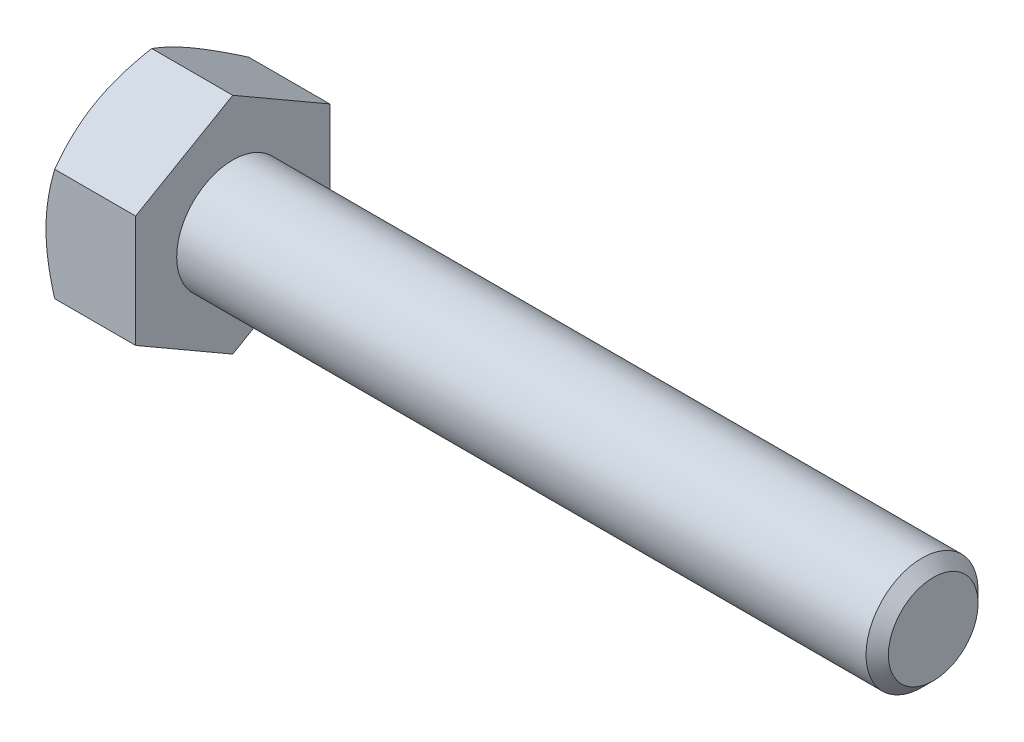
ISO-10303-21;
HEADER;
FILE_DESCRIPTION(('STEP AP214'),'2;1');
FILE_NAME('part.step','',(''),(''),'','','');
FILE_SCHEMA(('AUTOMOTIVE_DESIGN { 1 0 10303 214 1 1 1 1 }'));
ENDSEC;
DATA;
#1=APPLICATION_CONTEXT('core data for automotive mechanical design processes');
#2=APPLICATION_PROTOCOL_DEFINITION('international standard','automotive_design',2000,#1);
#3=PRODUCT_CONTEXT('',#1,'mechanical');
#4=PRODUCT('Part','Part','',(#3));
#5=PRODUCT_RELATED_PRODUCT_CATEGORY('part','',(#4));
#6=PRODUCT_DEFINITION_FORMATION('','',#4);
#7=PRODUCT_DEFINITION_CONTEXT('part definition',#1,'design');
#8=PRODUCT_DEFINITION('design','',#6,#7);
#9=PRODUCT_DEFINITION_SHAPE('','',#8);
#10=(LENGTH_UNIT() NAMED_UNIT(*) SI_UNIT(.MILLI.,.METRE.));
#11=(NAMED_UNIT(*) PLANE_ANGLE_UNIT() SI_UNIT($,.RADIAN.));
#12=(NAMED_UNIT(*) SI_UNIT($,.STERADIAN.) SOLID_ANGLE_UNIT());
#13=UNCERTAINTY_MEASURE_WITH_UNIT(LENGTH_MEASURE(1.E-05),#10,'distance_accuracy_value','');
#14=(GEOMETRIC_REPRESENTATION_CONTEXT(3) GLOBAL_UNCERTAINTY_ASSIGNED_CONTEXT((#13)) GLOBAL_UNIT_ASSIGNED_CONTEXT((#10,
#11,#12)) REPRESENTATION_CONTEXT('',''));
#15=CARTESIAN_POINT('',(0.,0.,0.));
#16=DIRECTION('',(0.,0.,1.));
#17=DIRECTION('',(1.,0.,0.));
#18=AXIS2_PLACEMENT_3D('',#15,#16,#17);
#19=CARTESIAN_POINT('',(19.2,-18.,10.3923048454133));
#20=DIRECTION('',(0.,0.866025403784439,-0.5));
#21=DIRECTION('',(0.,0.5,0.866025403784439));
#22=AXIS2_PLACEMENT_3D('',#19,#20,#21);
#23=PLANE('',#22);
#24=CARTESIAN_POINT('',(1.8564731276988,-24.0001154700538,-0.000200000000003051));
#25=CARTESIAN_POINT('',(1.70420497682992,-23.7363605616872,0.456636902036741));
#26=CARTESIAN_POINT('',(1.55884654250785,-23.4715768677398,0.915255712969345));
#27=CARTESIAN_POINT('',(1.28386975831447,-22.9398862308411,1.83617090998652));
#28=CARTESIAN_POINT('',(1.15425658531419,-22.6729786201371,2.29846845265265));
#29=CARTESIAN_POINT('',(0.912512595846756,-22.1365243076466,3.22763457782561));
#30=CARTESIAN_POINT('',(0.800423144133508,-21.8669729114129,3.69451129135353));
#31=CARTESIAN_POINT('',(0.596133528378377,-21.3259971369607,4.63150881836863));
#32=CARTESIAN_POINT('',(0.503932225275748,-21.0545728669274,5.10162944447372));
#33=CARTESIAN_POINT('',(0.343340490949208,-20.5168061337673,6.03306874892725));
#34=CARTESIAN_POINT('',(0.274418527658166,-20.2505035939992,6.49431827799029));
#35=CARTESIAN_POINT('',(0.158852016136899,-19.7166782897964,7.41893082723538));
#36=CARTESIAN_POINT('',(0.112207896719898,-19.449155501974,7.88229388792627));
#37=CARTESIAN_POINT('',(0.0423748141827282,-18.9136605340693,8.8097983795347));
#38=CARTESIAN_POINT('',(0.0191579795280419,-18.6456892688105,9.2739382259314));
#39=CARTESIAN_POINT('',(-0.00332126042467664,-18.1094994426216,10.2026462473922));
#40=CARTESIAN_POINT('',(-0.00258440592872094,-17.8412808895892,10.667214408777));
#41=CARTESIAN_POINT('',(0.0211707638629725,-17.3398411459993,11.5357335216089));
#42=CARTESIAN_POINT('',(0.041292345668217,-17.1065842440052,11.9397463270788));
#43=CARTESIAN_POINT('',(0.0992698070061981,-16.6406273093356,12.7468074120657));
#44=CARTESIAN_POINT('',(0.137125432541254,-16.4079272687324,13.1498557053137));
#45=CARTESIAN_POINT('',(0.229914897964642,-15.9431700326962,13.9548388513136));
#46=CARTESIAN_POINT('',(0.28486418136647,-15.7111136107975,14.3567723642649));
#47=CARTESIAN_POINT('',(0.410868445121499,-15.2481118982151,15.158714854449));
#48=CARTESIAN_POINT('',(0.481923357233602,-15.0171666028277,15.5587238398289));
#49=CARTESIAN_POINT('',(0.72107005873722,-14.3160658221991,16.7730660131039));
#50=CARTESIAN_POINT('',(0.913020547282522,-13.8479022980801,17.5839490231285));
#51=CARTESIAN_POINT('',(1.23980731969377,-13.1508272022203,18.7913185058486));
#52=CARTESIAN_POINT('',(1.35509548926815,-12.9195302834635,19.1919365207695));
#53=CARTESIAN_POINT('',(1.59734334708933,-12.458536301089,19.9904015202257));
#54=CARTESIAN_POINT('',(1.72429974567885,-12.2288388060681,20.3882492519732));
#55=CARTESIAN_POINT('',(1.8564731276988,-11.9998845299462,20.7848096908265));
#56=B_SPLINE_CURVE_WITH_KNOTS('',3,(#24,#25,#26,#27,#28,#29,#30,#31,#32,#33,#34,#35,#36,#37,#38,
#39,#40,#41,#42,#43,#44,#45,#46,#47,#48,#49,#50,#51,#52,#53,#54,#55),.UNSPECIFIED.,.F.,.F.,(4,2,
2,2,2,2,2,2,2,2,2,2,2,2,2,4),(0.,1.64718297300076,3.29490606443561,4.94646171874215,
6.59792275780601,8.2086223270406,9.81935289844249,11.4281649098404,13.0369272065082,
14.4374315945823,15.8379159244004,17.2396692350121,18.6414166063712,21.5066563429886,
22.9367804503372,24.3665025883493),.UNSPECIFIED.);
#57=CARTESIAN_POINT('',(1.85640646055101,-24.,0.));
#58=VERTEX_POINT('',#57);
#59=CARTESIAN_POINT('',(0.,-18.,10.3923048454133));
#60=VERTEX_POINT('',#59);
#61=EDGE_CURVE('E243',#58,#60,#56,.T.);
#62=ORIENTED_EDGE('',*,*,#61,.F.);
#63=DIRECTION('',(-1.,0.,0.));
#64=VECTOR('',#63,1.);
#65=CARTESIAN_POINT('',(19.2,-24.,0.));
#66=LINE('',#65,#64);
#67=CARTESIAN_POINT('',(19.2,-24.,0.));
#68=VERTEX_POINT('',#67);
#69=EDGE_CURVE('E140',#68,#58,#66,.T.);
#70=ORIENTED_EDGE('',*,*,#69,.F.);
#71=DIRECTION('',(0.,-0.5,-0.866025403784439));
#72=VECTOR('',#71,1.);
#73=CARTESIAN_POINT('',(19.2,-18.,10.3923048454133));
#74=LINE('',#73,#72);
#75=CARTESIAN_POINT('',(19.2,-12.,20.7846096908265));
#76=VERTEX_POINT('',#75);
#77=EDGE_CURVE('E409',#76,#68,#74,.T.);
#78=ORIENTED_EDGE('',*,*,#77,.F.);
#79=DIRECTION('',(-1.,0.,0.));
#80=VECTOR('',#79,1.);
#81=CARTESIAN_POINT('',(19.2,-12.,20.7846096908265));
#82=LINE('',#81,#80);
#83=CARTESIAN_POINT('',(1.85640646055101,-12.,20.7846096908265));
#84=VERTEX_POINT('',#83);
#85=EDGE_CURVE('E397',#76,#84,#82,.T.);
#86=ORIENTED_EDGE('',*,*,#85,.T.);
#87=EDGE_CURVE('E195',#60,#84,#56,.T.);
#88=ORIENTED_EDGE('',*,*,#87,.F.);
#89=EDGE_LOOP('',(#62,#70,#78,#86,#88));
#90=FACE_BOUND('',#89,.T.);
#91=ADVANCED_FACE('F42',(#90),#23,.F.);
#92=CARTESIAN_POINT('',(19.2,-18.,-10.3923048454133));
#93=DIRECTION('',(0.,0.866025403784438,0.5));
#94=DIRECTION('',(0.,-0.5,0.866025403784439));
#95=AXIS2_PLACEMENT_3D('',#92,#93,#94);
#96=PLANE('',#95);
#97=CARTESIAN_POINT('',(1.8564731276988,-11.9998845299462,-20.7848096908265));
#98=CARTESIAN_POINT('',(1.70420497682991,-12.2636394383128,-20.3279727887898));
#99=CARTESIAN_POINT('',(1.55884654250784,-12.5284231322602,-19.8693539778572));
#100=CARTESIAN_POINT('',(1.28386975831447,-13.0601137691589,-18.94843878084));
#101=CARTESIAN_POINT('',(1.15425658531418,-13.3270213798629,-18.4861412381739));
#102=CARTESIAN_POINT('',(0.912512595846757,-13.8634756923534,-17.5569751130009));
#103=CARTESIAN_POINT('',(0.80042314413351,-14.1330270885871,-17.090098399473));
#104=CARTESIAN_POINT('',(0.596133528378377,-14.6740028630393,-16.1531008724579));
#105=CARTESIAN_POINT('',(0.503932225275748,-14.9454271330726,-15.6829802463528));
#106=CARTESIAN_POINT('',(0.343340490949207,-15.4831938662327,-14.7515409418993));
#107=CARTESIAN_POINT('',(0.274418527658167,-15.7494964060008,-14.2902914128362));
#108=CARTESIAN_POINT('',(0.158852016136901,-16.2833217102036,-13.3656788635911));
#109=CARTESIAN_POINT('',(0.112207896719899,-16.550844498026,-12.9023158029003));
#110=CARTESIAN_POINT('',(0.0423748141827289,-17.0863394659307,-11.9748113112918));
#111=CARTESIAN_POINT('',(0.0191579795280428,-17.3543107311895,-11.5106714648951));
#112=CARTESIAN_POINT('',(-0.00332126042467492,-17.8905005573784,-10.5819634434344));
#113=CARTESIAN_POINT('',(-0.00258440592871848,-18.1587191104109,-10.1173952820495));
#114=CARTESIAN_POINT('',(0.0211707638629761,-18.6601588540007,-9.24887616921767));
#115=CARTESIAN_POINT('',(0.0412923456682211,-18.8934157559948,-8.84486336374769));
#116=CARTESIAN_POINT('',(0.0992698070062012,-19.3593726906644,-8.03780227876087));
#117=CARTESIAN_POINT('',(0.137125432541256,-19.5920727312676,-7.6347539855128));
#118=CARTESIAN_POINT('',(0.229914897964644,-20.0568299673038,-6.82977083951292));
#119=CARTESIAN_POINT('',(0.284864181366474,-20.2888863892025,-6.42783732656168));
#120=CARTESIAN_POINT('',(0.410868445121505,-20.7518881017849,-5.62589483637756));
#121=CARTESIAN_POINT('',(0.481923357233607,-20.9828333971723,-5.2258858509976));
#122=CARTESIAN_POINT('',(0.721070058737223,-21.6839341778009,-4.01154367772264));
#123=CARTESIAN_POINT('',(0.913020547282525,-22.1520977019199,-3.200660667698));
#124=CARTESIAN_POINT('',(1.23980731969378,-22.8491727977797,-1.99329118497798));
#125=CARTESIAN_POINT('',(1.35509548926815,-23.0804697165365,-1.59267317005705));
#126=CARTESIAN_POINT('',(1.59734334708933,-23.541463698911,-0.794208170600867));
#127=CARTESIAN_POINT('',(1.72429974567886,-23.7711611939319,-0.396360438853321));
#128=CARTESIAN_POINT('',(1.85647312769881,-24.0001154700538,0.000199999999993356));
#129=B_SPLINE_CURVE_WITH_KNOTS('',3,(#97,#98,#99,#100,#101,#102,#103,#104,#105,#106,#107,#108,
#109,#110,#111,#112,#113,#114,#115,#116,#117,#118,#119,#120,#121,#122,#123,#124,#125,#126,#127,
#128),.UNSPECIFIED.,.F.,.F.,(4,2,2,2,2,2,2,2,2,2,2,2,2,2,2,4),(0.,1.64718297300076,
3.29490606443561,4.94646171874215,6.59792275780601,8.20862232704061,9.81935289844249,
11.4281649098404,13.0369272065082,14.4374315945823,15.8379159244004,17.2396692350121,
18.6414166063712,21.5066563429886,22.9367804503372,24.3665025883493),.UNSPECIFIED.);
#130=CARTESIAN_POINT('',(1.85640646055101,-12.,-20.7846096908265));
#131=VERTEX_POINT('',#130);
#132=CARTESIAN_POINT('',(0.,-18.,-10.3923048454133));
#133=VERTEX_POINT('',#132);
#134=EDGE_CURVE('E135',#131,#133,#129,.T.);
#135=ORIENTED_EDGE('',*,*,#134,.F.);
#136=DIRECTION('',(-1.,0.,0.));
#137=VECTOR('',#136,1.);
#138=CARTESIAN_POINT('',(19.2,-12.,-20.7846096908265));
#139=LINE('',#138,#137);
#140=CARTESIAN_POINT('',(19.2,-12.,-20.7846096908265));
#141=VERTEX_POINT('',#140);
#142=EDGE_CURVE('E149',#141,#131,#139,.T.);
#143=ORIENTED_EDGE('',*,*,#142,.F.);
#144=DIRECTION('',(0.,0.5,-0.866025403784438));
#145=VECTOR('',#144,1.);
#146=CARTESIAN_POINT('',(19.2,-18.,-10.3923048454133));
#147=LINE('',#146,#145);
#148=EDGE_CURVE('E249',#68,#141,#147,.T.);
#149=ORIENTED_EDGE('',*,*,#148,.F.);
#150=ORIENTED_EDGE('',*,*,#69,.T.);
#151=EDGE_CURVE('E159',#133,#58,#129,.T.);
#152=ORIENTED_EDGE('',*,*,#151,.F.);
#153=EDGE_LOOP('',(#135,#143,#149,#150,#152));
#154=FACE_BOUND('',#153,.T.);
#155=ADVANCED_FACE('F232',(#154),#96,.F.);
#156=CARTESIAN_POINT('',(19.2,0.,-20.7846096908265));
#157=DIRECTION('',(0.,0.,1.));
#158=DIRECTION('',(0.,-1.,0.));
#159=AXIS2_PLACEMENT_3D('',#156,#157,#158);
#160=PLANE('',#159);
#161=CARTESIAN_POINT('',(15.4365753826942,42.7351963396777,-20.7846096908265));
#162=CARTESIAN_POINT('',(15.1782001230141,42.2375504579259,-20.7846096908265));
#163=CARTESIAN_POINT('',(14.9205008424216,41.7395537279378,-20.7846096908265));
#164=CARTESIAN_POINT('',(14.4065935235221,40.7427897192709,-20.7846096908265));
#165=CARTESIAN_POINT('',(14.1503854894428,40.2440224384126,-20.7846096908265));
#166=CARTESIAN_POINT('',(13.3841874976782,38.7464229614954,-20.7846096908265));
#167=CARTESIAN_POINT('',(12.8766458079479,37.7463357499289,-20.7846096908265));
#168=CARTESIAN_POINT('',(11.8687046110495,35.740585285373,-20.7846096908265));
#169=CARTESIAN_POINT('',(11.3683176523895,34.7349157197309,-20.7846096908265));
#170=CARTESIAN_POINT('',(10.3773529444861,32.7187656852211,-20.7846096908265));
#171=CARTESIAN_POINT('',(9.88677504418478,31.7082852907364,-20.7846096908265));
#172=CARTESIAN_POINT('',(8.89098212398312,29.6253151675214,-20.7846096908265));
#173=CARTESIAN_POINT('',(8.38646255239789,28.5524923063502,-20.7846096908265));
#174=CARTESIAN_POINT('',(7.39477343103312,26.398760720087,-20.7846096908265));
#175=CARTESIAN_POINT('',(6.9076046018839,25.3178516614009,-20.7846096908265));
#176=CARTESIAN_POINT('',(6.19395911010642,23.6893359387004,-20.7846096908265));
#177=CARTESIAN_POINT('',(5.95898796329796,23.1454489410646,-20.7846096908265));
#178=CARTESIAN_POINT('',(5.49555007418073,22.0549139153183,-20.7846096908265));
#179=CARTESIAN_POINT('',(5.26708324689029,21.5082659233915,-20.7846096908265));
#180=CARTESIAN_POINT('',(4.81763359191787,20.4119412090459,-20.7846096908265));
#181=CARTESIAN_POINT('',(4.59665024200561,19.8622647010961,-20.7846096908265));
#182=CARTESIAN_POINT('',(4.16330092883257,18.7595322812737,-20.7846096908265));
#183=CARTESIAN_POINT('',(3.9509347919298,18.2064764377555,-20.7846096908265));
#184=CARTESIAN_POINT('',(3.50964661408538,17.0257175003698,-20.7846096908265));
#185=CARTESIAN_POINT('',(3.28207699733136,16.3975069770108,-20.7846096908265));
#186=CARTESIAN_POINT('',(2.84185286992129,15.1358634730652,-20.7846096908265));
#187=CARTESIAN_POINT('',(2.62919832486909,14.502430504526,-20.7846096908265));
#188=CARTESIAN_POINT('',(2.22142797041994,13.2297874539747,-20.7846096908265));
#189=CARTESIAN_POINT('',(2.02631541783627,12.5905763233441,-20.7846096908265));
#190=CARTESIAN_POINT('',(1.65674077494716,11.3061766050275,-20.7846096908265));
#191=CARTESIAN_POINT('',(1.48227865352408,10.6609880263503,-20.7846096908265));
#192=CARTESIAN_POINT('',(1.16069442824226,9.37757944037591,-20.7846096908265));
#193=CARTESIAN_POINT('',(1.01309291973356,8.73948035870573,-20.7846096908265));
#194=CARTESIAN_POINT('',(0.744428159888322,7.45773163993493,-20.7846096908265));
#195=CARTESIAN_POINT('',(0.623362581757385,6.81408249463785,-20.7846096908265));
#196=CARTESIAN_POINT('',(0.411160078732894,5.52212335543822,-20.7846096908265));
#197=CARTESIAN_POINT('',(0.320009542439026,4.87381561880367,-20.7846096908265));
#198=CARTESIAN_POINT('',(0.170501882779792,3.57339987577271,-20.7846096908265));
#199=CARTESIAN_POINT('',(0.112144274499404,2.92129192571483,-20.7846096908265));
#200=CARTESIAN_POINT('',(0.0296859334714068,1.60463292415903,-20.7846096908265));
#201=CARTESIAN_POINT('',(0.00613586787265403,0.940046910142542,-20.7846096908265));
#202=CARTESIAN_POINT('',(-0.00403039108903835,-0.389409138129747,-20.7846096908265));
#203=CARTESIAN_POINT('',(0.00935336688645884,-1.05427917201019,-20.7846096908265));
#204=CARTESIAN_POINT('',(0.0725267417839819,-2.38241239876369,-20.7846096908265));
#205=CARTESIAN_POINT('',(0.122324318983771,-3.04567520847449,-20.7846096908265));
#206=CARTESIAN_POINT('',(0.256441221489205,-4.36867761851294,-20.7846096908265));
#207=CARTESIAN_POINT('',(0.340761456006645,-5.0284171255849,-20.7846096908265));
#208=CARTESIAN_POINT('',(0.543132854242192,-6.356870471909,-20.7846096908265));
#209=CARTESIAN_POINT('',(0.661856749114912,-7.02548085274417,-20.7846096908265));
#210=CARTESIAN_POINT('',(0.928598305854016,-8.3567871779243,-20.7846096908265));
#211=CARTESIAN_POINT('',(1.07661642314574,-9.01948303015109,-20.7846096908265));
#212=CARTESIAN_POINT('',(1.39817496043688,-10.3388158753969,-20.7846096908265));
#213=CARTESIAN_POINT('',(1.57172301041282,-10.9954509945151,-20.7846096908265));
#214=CARTESIAN_POINT('',(1.94066974695683,-12.3025159921132,-20.7846096908265));
#215=CARTESIAN_POINT('',(2.13606850262356,-12.9529458509631,-20.7846096908265));
#216=CARTESIAN_POINT('',(2.54787647733615,-14.2556215747884,-20.7846096908265));
#217=CARTESIAN_POINT('',(2.76450834199087,-14.9077966991281,-20.7846096908265));
#218=CARTESIAN_POINT('',(3.21385089652054,-16.2066062021254,-20.7846096908265));
#219=CARTESIAN_POINT('',(3.44656260738667,-16.8532402260149,-20.7846096908265));
#220=CARTESIAN_POINT('',(3.925608321145,-18.1416069191262,-20.7846096908265));
#221=CARTESIAN_POINT('',(4.17194567395359,-18.7833383384918,-20.7846096908265));
#222=CARTESIAN_POINT('',(4.67608824983811,-20.0622534059696,-20.7846096908265));
#223=CARTESIAN_POINT('',(4.93389324742564,-20.6994371432173,-20.7846096908265));
#224=CARTESIAN_POINT('',(5.45957252564696,-21.9705929002849,-20.7846096908265));
#225=CARTESIAN_POINT('',(5.72745939094396,-22.604559704099,-20.7846096908265));
#226=CARTESIAN_POINT('',(6.27153990979845,-23.8689150095967,-20.7846096908265));
#227=CARTESIAN_POINT('',(6.54773359625541,-24.4993034970964,-20.7846096908265));
#228=CARTESIAN_POINT('',(7.1071859341126,-25.7568294075045,-20.7846096908265));
#229=CARTESIAN_POINT('',(7.3904436096661,-26.3839672651679,-20.7846096908265));
#230=CARTESIAN_POINT('',(7.96306773382719,-27.6354418873609,-20.7846096908265));
#231=CARTESIAN_POINT('',(8.25243416982651,-28.2597786576686,-20.7846096908265));
#232=CARTESIAN_POINT('',(9.09261210441168,-30.0526700155559,-20.7846096908265));
#233=CARTESIAN_POINT('',(9.65006402044101,-31.2181138600505,-20.7846096908265));
#234=CARTESIAN_POINT('',(10.7792267251682,-33.5421025420665,-20.7846096908265));
#235=CARTESIAN_POINT('',(11.3509380716336,-34.7006471075152,-20.7846096908265));
#236=CARTESIAN_POINT('',(12.5033567528949,-37.0077945469623,-20.7846096908265));
#237=CARTESIAN_POINT('',(13.0840220705692,-38.1564184327317,-20.7846096908265));
#238=CARTESIAN_POINT('',(13.9616188799111,-39.8759132018085,-20.7846096908265));
#239=CARTESIAN_POINT('',(14.2552377532654,-40.4484792332988,-20.7846096908265));
#240=CARTESIAN_POINT('',(14.8444666900635,-41.5925826559036,-20.7846096908265));
#241=CARTESIAN_POINT('',(15.1400767444053,-42.164120051705,-20.7846096908265));
#242=CARTESIAN_POINT('',(15.4365753826942,-42.7351963396777,-20.7846096908265));
#243=B_SPLINE_CURVE_WITH_KNOTS('',3,(#161,#162,#163,#164,#165,#166,#167,#168,#169,#170,#171,
#172,#173,#174,#175,#176,#177,#178,#179,#180,#181,#182,#183,#184,#185,#186,#187,#188,#189,#190,
#191,#192,#193,#194,#195,#196,#197,#198,#199,#200,#201,#202,#203,#204,#205,#206,#207,#208,#209,
#210,#211,#212,#213,#214,#215,#216,#217,#218,#219,#220,#221,#222,#223,#224,#225,#226,#227,#228,
#229,#230,#231,#232,#233,#234,#235,#236,#237,#238,#239,#240,#241,#242),.UNSPECIFIED.,.F.,.F.,(4,
2,2,2,2,2,2,2,2,2,2,2,2,2,2,2,2,2,2,2,2,2,2,2,2,2,2,2,2,2,2,2,2,2,2,2,2,2,2,2,4),(0.,
1.68216511624376,3.3643349990115,6.72881886572706,10.0986173985111,13.468363996922,
17.0248524624178,20.5814884680961,22.3588742955726,24.1362368900912,25.9134751956865,
27.6906776710652,29.69499374197,31.6993051905018,33.7039879905968,35.7086677698428,
37.6730184948026,39.637196907343,41.6004803719791,43.5637348044197,45.5577279859555,
47.5517185403391,49.5461451232969,51.5406242361865,53.5770909409603,55.6135893083398,
57.650697552863,59.6878122395322,61.7492048973111,63.810728563878,65.8727613364008,
67.9347535810604,69.9994111245146,72.0640768461977,74.1284589098883,76.192836713184,
80.068401521298,83.9441181633394,87.8052301786373,89.7356145319587,91.6659900672801),.UNSPECIFIED.);
#244=CARTESIAN_POINT('',(1.85640646055101,12.,-20.7846096908265));
#245=VERTEX_POINT('',#244);
#246=CARTESIAN_POINT('',(0.,0.,-20.7846096908265));
#247=VERTEX_POINT('',#246);
#248=EDGE_CURVE('E114',#245,#247,#243,.T.);
#249=ORIENTED_EDGE('',*,*,#248,.F.);
#250=DIRECTION('',(-1.,0.,0.));
#251=VECTOR('',#250,1.);
#252=CARTESIAN_POINT('',(19.2,12.,-20.7846096908265));
#253=LINE('',#252,#251);
#254=CARTESIAN_POINT('',(19.2,12.,-20.7846096908265));
#255=VERTEX_POINT('',#254);
#256=EDGE_CURVE('E252',#255,#245,#253,.T.);
#257=ORIENTED_EDGE('',*,*,#256,.F.);
#258=DIRECTION('',(0.,1.,0.));
#259=VECTOR('',#258,1.);
#260=CARTESIAN_POINT('',(19.2,0.,-20.7846096908265));
#261=LINE('',#260,#259);
#262=EDGE_CURVE('E404',#141,#255,#261,.T.);
#263=ORIENTED_EDGE('',*,*,#262,.F.);
#264=ORIENTED_EDGE('',*,*,#142,.T.);
#265=EDGE_CURVE('E127',#247,#131,#243,.T.);
#266=ORIENTED_EDGE('',*,*,#265,.F.);
#267=EDGE_LOOP('',(#249,#257,#263,#264,#266));
#268=FACE_BOUND('',#267,.T.);
#269=ADVANCED_FACE('F146',(#268),#160,.F.);
#270=CARTESIAN_POINT('',(19.2,18.,-10.3923048454133));
#271=DIRECTION('',(0.,-0.866025403784439,0.5));
#272=DIRECTION('',(0.,-0.5,-0.866025403784439));
#273=AXIS2_PLACEMENT_3D('',#270,#271,#272);
#274=PLANE('',#273);
#275=CARTESIAN_POINT('',(1.8564731276988,24.0001154700538,0.000200000000004368));
#276=CARTESIAN_POINT('',(1.70420497682991,23.7363605616872,-0.45663690203674));
#277=CARTESIAN_POINT('',(1.55884654250784,23.4715768677398,-0.915255712969344));
#278=CARTESIAN_POINT('',(1.28386975831447,22.9398862308411,-1.83617090998652));
#279=CARTESIAN_POINT('',(1.15425658531418,22.6729786201371,-2.29846845265265));
#280=CARTESIAN_POINT('',(0.912512595846754,22.1365243076466,-3.22763457782561));
#281=CARTESIAN_POINT('',(0.800423144133507,21.8669729114129,-3.69451129135353));
#282=CARTESIAN_POINT('',(0.596133528378375,21.3259971369607,-4.63150881836863));
#283=CARTESIAN_POINT('',(0.503932225275746,21.0545728669274,-5.10162944447372));
#284=CARTESIAN_POINT('',(0.343340490949205,20.5168061337673,-6.03306874892725));
#285=CARTESIAN_POINT('',(0.274418527658163,20.2505035939992,-6.4943182779903));
#286=CARTESIAN_POINT('',(0.158852016136896,19.7166782897964,-7.41893082723539));
#287=CARTESIAN_POINT('',(0.112207896719895,19.449155501974,-7.88229388792627));
#288=CARTESIAN_POINT('',(0.0423748141827256,18.9136605340693,-8.8097983795347));
#289=CARTESIAN_POINT('',(0.0191579795280395,18.6456892688105,-9.2739382259314));
#290=CARTESIAN_POINT('',(-0.00332126042467856,18.1094994426216,-10.2026462473922));
#291=CARTESIAN_POINT('',(-0.00258440592872253,17.8412808895891,-10.667214408777));
#292=CARTESIAN_POINT('',(0.0211707638629718,17.3398411459993,-11.5357335216089));
#293=CARTESIAN_POINT('',(0.0412923456682169,17.1065842440052,-11.9397463270788));
#294=CARTESIAN_POINT('',(0.0992698070061978,16.6406273093356,-12.7468074120657));
#295=CARTESIAN_POINT('',(0.137125432541253,16.4079272687324,-13.1498557053137));
#296=CARTESIAN_POINT('',(0.229914897964641,15.9431700326962,-13.9548388513136));
#297=CARTESIAN_POINT('',(0.28486418136647,15.7111136107975,-14.3567723642648));
#298=CARTESIAN_POINT('',(0.4108684451215,15.2481118982151,-15.158714854449));
#299=CARTESIAN_POINT('',(0.481923357233603,15.0171666028277,-15.5587238398289));
#300=CARTESIAN_POINT('',(0.72107005873722,14.3160658221991,-16.7730660131039));
#301=CARTESIAN_POINT('',(0.913020547282522,13.8479022980801,-17.5839490231285));
#302=CARTESIAN_POINT('',(1.23980731969377,13.1508272022203,-18.7913185058486));
#303=CARTESIAN_POINT('',(1.35509548926815,12.9195302834635,-19.1919365207695));
#304=CARTESIAN_POINT('',(1.59734334708933,12.458536301089,-19.9904015202257));
#305=CARTESIAN_POINT('',(1.72429974567885,12.2288388060681,-20.3882492519732));
#306=CARTESIAN_POINT('',(1.8564731276988,11.9998845299462,-20.7848096908265));
#307=B_SPLINE_CURVE_WITH_KNOTS('',3,(#275,#276,#277,#278,#279,#280,#281,#282,#283,#284,#285,
#286,#287,#288,#289,#290,#291,#292,#293,#294,#295,#296,#297,#298,#299,#300,#301,#302,#303,#304,
#305,#306),.UNSPECIFIED.,.F.,.F.,(4,2,2,2,2,2,2,2,2,2,2,2,2,2,2,4),(0.,1.64718297300076,
3.29490606443561,4.94646171874214,6.59792275780601,8.20862232704061,9.81935289844249,
11.4281649098404,13.0369272065082,14.4374315945823,15.8379159244004,17.2396692350121,
18.6414166063712,21.5066563429886,22.9367804503372,24.3665025883493),.UNSPECIFIED.);
#308=CARTESIAN_POINT('',(1.85640646055101,24.,0.));
#309=VERTEX_POINT('',#308);
#310=CARTESIAN_POINT('',(0.,18.,-10.3923048454133));
#311=VERTEX_POINT('',#310);
#312=EDGE_CURVE('E58',#309,#311,#307,.T.);
#313=ORIENTED_EDGE('',*,*,#312,.F.);
#314=DIRECTION('',(-1.,0.,0.));
#315=VECTOR('',#314,1.);
#316=CARTESIAN_POINT('',(19.2,24.,0.));
#317=LINE('',#316,#315);
#318=CARTESIAN_POINT('',(19.2,24.,0.));
#319=VERTEX_POINT('',#318);
#320=EDGE_CURVE('E389',#319,#309,#317,.T.);
#321=ORIENTED_EDGE('',*,*,#320,.F.);
#322=DIRECTION('',(0.,0.5,0.866025403784439));
#323=VECTOR('',#322,1.);
#324=CARTESIAN_POINT('',(19.2,18.,-10.3923048454133));
#325=LINE('',#324,#323);
#326=EDGE_CURVE('E403',#255,#319,#325,.T.);
#327=ORIENTED_EDGE('',*,*,#326,.F.);
#328=ORIENTED_EDGE('',*,*,#256,.T.);
#329=EDGE_CURVE('E121',#311,#245,#307,.T.);
#330=ORIENTED_EDGE('',*,*,#329,.F.);
#331=EDGE_LOOP('',(#313,#321,#327,#328,#330));
#332=FACE_BOUND('',#331,.T.);
#333=ADVANCED_FACE('F205',(#332),#274,.F.);
#334=CARTESIAN_POINT('',(19.2,18.,10.3923048454133));
#335=DIRECTION('',(0.,-0.866025403784439,-0.5));
#336=DIRECTION('',(0.,0.5,-0.866025403784439));
#337=AXIS2_PLACEMENT_3D('',#334,#335,#336);
#338=PLANE('',#337);
#339=CARTESIAN_POINT('',(1.8564731276988,11.9998845299462,20.7848096908265));
#340=CARTESIAN_POINT('',(1.70420497682991,12.2636394383128,20.3279727887898));
#341=CARTESIAN_POINT('',(1.55884654250784,12.5284231322602,19.8693539778572));
#342=CARTESIAN_POINT('',(1.28386975831447,13.0601137691589,18.94843878084));
#343=CARTESIAN_POINT('',(1.15425658531418,13.3270213798629,18.4861412381739));
#344=CARTESIAN_POINT('',(0.912512595846756,13.8634756923534,17.5569751130009));
#345=CARTESIAN_POINT('',(0.800423144133508,14.1330270885871,17.090098399473));
#346=CARTESIAN_POINT('',(0.596133528378377,14.6740028630393,16.1531008724579));
#347=CARTESIAN_POINT('',(0.503932225275748,14.9454271330726,15.6829802463528));
#348=CARTESIAN_POINT('',(0.343340490949207,15.4831938662327,14.7515409418993));
#349=CARTESIAN_POINT('',(0.274418527658165,15.7494964060008,14.2902914128362));
#350=CARTESIAN_POINT('',(0.158852016136897,16.2833217102036,13.3656788635911));
#351=CARTESIAN_POINT('',(0.112207896719896,16.550844498026,12.9023158029003));
#352=CARTESIAN_POINT('',(0.0423748141827269,17.0863394659307,11.9748113112918));
#353=CARTESIAN_POINT('',(0.0191579795280418,17.3543107311895,11.5106714648951));
#354=CARTESIAN_POINT('',(-0.00332126042467567,17.8905005573784,10.5819634434344));
#355=CARTESIAN_POINT('',(-0.00258440592871992,18.1587191104109,10.1173952820495));
#356=CARTESIAN_POINT('',(0.0211707638629734,18.6601588540007,9.24887616921766));
#357=CARTESIAN_POINT('',(0.0412923456682176,18.8934157559948,8.84486336374768));
#358=CARTESIAN_POINT('',(0.0992698070061979,19.3593726906644,8.03780227876086));
#359=CARTESIAN_POINT('',(0.137125432541254,19.5920727312676,7.6347539855128));
#360=CARTESIAN_POINT('',(0.229914897964642,20.0568299673038,6.82977083951292));
#361=CARTESIAN_POINT('',(0.284864181366472,20.2888863892025,6.42783732656168));
#362=CARTESIAN_POINT('',(0.410868445121502,20.7518881017849,5.62589483637756));
#363=CARTESIAN_POINT('',(0.481923357233604,20.9828333971723,5.2258858509976));
#364=CARTESIAN_POINT('',(0.72107005873722,21.6839341778009,4.01154367772264));
#365=CARTESIAN_POINT('',(0.913020547282524,22.1520977019199,3.200660667698));
#366=CARTESIAN_POINT('',(1.23980731969378,22.8491727977797,1.99329118497798));
#367=CARTESIAN_POINT('',(1.35509548926815,23.0804697165365,1.59267317005704));
#368=CARTESIAN_POINT('',(1.59734334708933,23.541463698911,0.794208170600861));
#369=CARTESIAN_POINT('',(1.72429974567885,23.7711611939319,0.396360438853315));
#370=CARTESIAN_POINT('',(1.8564731276988,24.0001154700538,-0.000199999999996405));
#371=B_SPLINE_CURVE_WITH_KNOTS('',3,(#339,#340,#341,#342,#343,#344,#345,#346,#347,#348,#349,
#350,#351,#352,#353,#354,#355,#356,#357,#358,#359,#360,#361,#362,#363,#364,#365,#366,#367,#368,
#369,#370),.UNSPECIFIED.,.F.,.F.,(4,2,2,2,2,2,2,2,2,2,2,2,2,2,2,4),(0.,1.64718297300076,
3.29490606443561,4.94646171874214,6.597922757806,8.2086223270406,9.81935289844249,
11.4281649098404,13.0369272065082,14.4374315945823,15.8379159244004,17.2396692350121,
18.6414166063712,21.5066563429886,22.9367804503372,24.3665025883493),.UNSPECIFIED.);
#372=CARTESIAN_POINT('',(1.85640646055099,12.,20.7846096908265));
#373=VERTEX_POINT('',#372);
#374=CARTESIAN_POINT('',(0.,18.,10.3923048454133));
#375=VERTEX_POINT('',#374);
#376=EDGE_CURVE('E66',#373,#375,#371,.T.);
#377=ORIENTED_EDGE('',*,*,#376,.F.);
#378=DIRECTION('',(-1.,0.,0.));
#379=VECTOR('',#378,1.);
#380=CARTESIAN_POINT('',(19.2,12.,20.7846096908265));
#381=LINE('',#380,#379);
#382=CARTESIAN_POINT('',(19.2,12.,20.7846096908265));
#383=VERTEX_POINT('',#382);
#384=EDGE_CURVE('E395',#383,#373,#381,.T.);
#385=ORIENTED_EDGE('',*,*,#384,.F.);
#386=DIRECTION('',(0.,-0.5,0.866025403784439));
#387=VECTOR('',#386,1.);
#388=CARTESIAN_POINT('',(19.2,18.,10.3923048454133));
#389=LINE('',#388,#387);
#390=EDGE_CURVE('E407',#319,#383,#389,.T.);
#391=ORIENTED_EDGE('',*,*,#390,.F.);
#392=ORIENTED_EDGE('',*,*,#320,.T.);
#393=EDGE_CURVE('E204',#375,#309,#371,.T.);
#394=ORIENTED_EDGE('',*,*,#393,.F.);
#395=EDGE_LOOP('',(#377,#385,#391,#392,#394));
#396=FACE_BOUND('',#395,.T.);
#397=ADVANCED_FACE('F208',(#396),#338,.F.);
#398=CARTESIAN_POINT('',(19.2,0.,20.7846096908265));
#399=DIRECTION('',(0.,0.,-1.));
#400=DIRECTION('',(-1.,0.,0.));
#401=AXIS2_PLACEMENT_3D('',#398,#399,#400);
#402=PLANE('',#401);
#403=CARTESIAN_POINT('',(15.4365753826942,-42.7351963396777,20.7846096908265));
#404=CARTESIAN_POINT('',(15.1782001230141,-42.2375504579258,20.7846096908265));
#405=CARTESIAN_POINT('',(14.9205008424216,-41.7395537279378,20.7846096908265));
#406=CARTESIAN_POINT('',(14.4065935235221,-40.7427897192709,20.7846096908265));
#407=CARTESIAN_POINT('',(14.1503854894428,-40.2440224384126,20.7846096908265));
#408=CARTESIAN_POINT('',(13.3841874976782,-38.7464229614954,20.7846096908265));
#409=CARTESIAN_POINT('',(12.8766458079479,-37.7463357499289,20.7846096908265));
#410=CARTESIAN_POINT('',(11.8687046110495,-35.740585285373,20.7846096908265));
#411=CARTESIAN_POINT('',(11.3683176523895,-34.7349157197309,20.7846096908265));
#412=CARTESIAN_POINT('',(10.3773529444861,-32.7187656852211,20.7846096908265));
#413=CARTESIAN_POINT('',(9.88677504418478,-31.7082852907364,20.7846096908265));
#414=CARTESIAN_POINT('',(8.89098212398312,-29.6253151675214,20.7846096908265));
#415=CARTESIAN_POINT('',(8.38646255239789,-28.5524923063502,20.7846096908265));
#416=CARTESIAN_POINT('',(7.39477343103313,-26.398760720087,20.7846096908265));
#417=CARTESIAN_POINT('',(6.9076046018839,-25.3178516614009,20.7846096908265));
#418=CARTESIAN_POINT('',(6.19395911010643,-23.6893359387004,20.7846096908265));
#419=CARTESIAN_POINT('',(5.95898796329797,-23.1454489410646,20.7846096908265));
#420=CARTESIAN_POINT('',(5.49555007418073,-22.0549139153183,20.7846096908265));
#421=CARTESIAN_POINT('',(5.26708324689029,-21.5082659233915,20.7846096908265));
#422=CARTESIAN_POINT('',(4.81763359191787,-20.4119412090459,20.7846096908265));
#423=CARTESIAN_POINT('',(4.59665024200561,-19.8622647010961,20.7846096908265));
#424=CARTESIAN_POINT('',(4.16330092883257,-18.7595322812737,20.7846096908265));
#425=CARTESIAN_POINT('',(3.9509347919298,-18.2064764377555,20.7846096908265));
#426=CARTESIAN_POINT('',(3.50964661408538,-17.0257175003698,20.7846096908265));
#427=CARTESIAN_POINT('',(3.28207699733137,-16.3975069770108,20.7846096908265));
#428=CARTESIAN_POINT('',(2.8418528699213,-15.1358634730652,20.7846096908265));
#429=CARTESIAN_POINT('',(2.62919832486909,-14.502430504526,20.7846096908265));
#430=CARTESIAN_POINT('',(2.22142797041995,-13.2297874539747,20.7846096908265));
#431=CARTESIAN_POINT('',(2.02631541783627,-12.5905763233441,20.7846096908265));
#432=CARTESIAN_POINT('',(1.65674077494716,-11.3061766050275,20.7846096908265));
#433=CARTESIAN_POINT('',(1.48227865352408,-10.6609880263503,20.7846096908265));
#434=CARTESIAN_POINT('',(1.16069442824226,-9.37757944037591,20.7846096908265));
#435=CARTESIAN_POINT('',(1.01309291973356,-8.73948035870573,20.7846096908265));
#436=CARTESIAN_POINT('',(0.744428159888321,-7.45773163993493,20.7846096908265));
#437=CARTESIAN_POINT('',(0.623362581757384,-6.81408249463785,20.7846096908265));
#438=CARTESIAN_POINT('',(0.411160078732893,-5.52212335543822,20.7846096908265));
#439=CARTESIAN_POINT('',(0.320009542439024,-4.87381561880367,20.7846096908265));
#440=CARTESIAN_POINT('',(0.17050188277979,-3.57339987577271,20.7846096908265));
#441=CARTESIAN_POINT('',(0.112144274499403,-2.92129192571483,20.7846096908265));
#442=CARTESIAN_POINT('',(0.0296859334714051,-1.60463292415903,20.7846096908265));
#443=CARTESIAN_POINT('',(0.00613586787265219,-0.940046910142542,20.7846096908265));
#444=CARTESIAN_POINT('',(-0.00403039108904042,0.389409138129747,20.7846096908265));
#445=CARTESIAN_POINT('',(0.00935336688645668,1.05427917201019,20.7846096908265));
#446=CARTESIAN_POINT('',(0.0725267417839795,2.38241239876369,20.7846096908265));
#447=CARTESIAN_POINT('',(0.122324318983769,3.04567520847449,20.7846096908265));
#448=CARTESIAN_POINT('',(0.256441221489203,4.36867761851294,20.7846096908265));
#449=CARTESIAN_POINT('',(0.340761456006642,5.0284171255849,20.7846096908265));
#450=CARTESIAN_POINT('',(0.543132854242189,6.356870471909,20.7846096908265));
#451=CARTESIAN_POINT('',(0.661856749114909,7.02548085274417,20.7846096908265));
#452=CARTESIAN_POINT('',(0.928598305854013,8.35678717792431,20.7846096908265));
#453=CARTESIAN_POINT('',(1.07661642314574,9.0194830301511,20.7846096908265));
#454=CARTESIAN_POINT('',(1.39817496043688,10.3388158753969,20.7846096908265));
#455=CARTESIAN_POINT('',(1.57172301041282,10.9954509945151,20.7846096908265));
#456=CARTESIAN_POINT('',(1.94066974695683,12.3025159921133,20.7846096908265));
#457=CARTESIAN_POINT('',(2.13606850262356,12.9529458509631,20.7846096908265));
#458=CARTESIAN_POINT('',(2.54787647733615,14.2556215747884,20.7846096908265));
#459=CARTESIAN_POINT('',(2.76450834199087,14.9077966991281,20.7846096908265));
#460=CARTESIAN_POINT('',(3.21385089652054,16.2066062021254,20.7846096908265));
#461=CARTESIAN_POINT('',(3.44656260738666,16.8532402260149,20.7846096908265));
#462=CARTESIAN_POINT('',(3.925608321145,18.1416069191262,20.7846096908265));
#463=CARTESIAN_POINT('',(4.17194567395359,18.7833383384918,20.7846096908265));
#464=CARTESIAN_POINT('',(4.67608824983811,20.0622534059696,20.7846096908265));
#465=CARTESIAN_POINT('',(4.93389324742564,20.6994371432173,20.7846096908265));
#466=CARTESIAN_POINT('',(5.45957252564696,21.9705929002849,20.7846096908265));
#467=CARTESIAN_POINT('',(5.72745939094396,22.6045597040991,20.7846096908265));
#468=CARTESIAN_POINT('',(6.27153990979845,23.8689150095967,20.7846096908265));
#469=CARTESIAN_POINT('',(6.54773359625541,24.4993034970964,20.7846096908265));
#470=CARTESIAN_POINT('',(7.1071859341126,25.7568294075045,20.7846096908265));
#471=CARTESIAN_POINT('',(7.3904436096661,26.3839672651679,20.7846096908265));
#472=CARTESIAN_POINT('',(7.96306773382719,27.6354418873609,20.7846096908265));
#473=CARTESIAN_POINT('',(8.25243416982652,28.2597786576686,20.7846096908265));
#474=CARTESIAN_POINT('',(9.09261210441168,30.052670015556,20.7846096908265));
#475=CARTESIAN_POINT('',(9.65006402044101,31.2181138600505,20.7846096908265));
#476=CARTESIAN_POINT('',(10.7792267251682,33.5421025420665,20.7846096908265));
#477=CARTESIAN_POINT('',(11.3509380716337,34.7006471075152,20.7846096908265));
#478=CARTESIAN_POINT('',(12.5033567528949,37.0077945469623,20.7846096908265));
#479=CARTESIAN_POINT('',(13.0840220705692,38.1564184327317,20.7846096908265));
#480=CARTESIAN_POINT('',(13.9616188799111,39.8759132018086,20.7846096908265));
#481=CARTESIAN_POINT('',(14.2552377532654,40.4484792332988,20.7846096908265));
#482=CARTESIAN_POINT('',(14.8444666900635,41.5925826559036,20.7846096908265));
#483=CARTESIAN_POINT('',(15.1400767444053,42.164120051705,20.7846096908265));
#484=CARTESIAN_POINT('',(15.4365753826942,42.7351963396777,20.7846096908265));
#485=B_SPLINE_CURVE_WITH_KNOTS('',3,(#403,#404,#405,#406,#407,#408,#409,#410,#411,#412,#413,
#414,#415,#416,#417,#418,#419,#420,#421,#422,#423,#424,#425,#426,#427,#428,#429,#430,#431,#432,
#433,#434,#435,#436,#437,#438,#439,#440,#441,#442,#443,#444,#445,#446,#447,#448,#449,#450,#451,
#452,#453,#454,#455,#456,#457,#458,#459,#460,#461,#462,#463,#464,#465,#466,#467,#468,#469,#470,
#471,#472,#473,#474,#475,#476,#477,#478,#479,#480,#481,#482,#483,#484),.UNSPECIFIED.,.F.,.F.,(4,
2,2,2,2,2,2,2,2,2,2,2,2,2,2,2,2,2,2,2,2,2,2,2,2,2,2,2,2,2,2,2,2,2,2,2,2,2,2,2,4),(0.,
1.68216511624376,3.3643349990115,6.72881886572706,10.0986173985111,13.468363996922,
17.0248524624178,20.5814884680961,22.3588742955726,24.1362368900912,25.9134751956865,
27.6906776710652,29.69499374197,31.6993051905018,33.7039879905968,35.7086677698428,
37.6730184948026,39.637196907343,41.6004803719791,43.5637348044197,45.5577279859555,
47.5517185403391,49.5461451232969,51.5406242361865,53.5770909409604,55.6135893083398,
57.650697552863,59.6878122395322,61.7492048973111,63.810728563878,65.8727613364009,
67.9347535810604,69.9994111245146,72.0640768461977,74.1284589098883,76.1928367131841,
80.068401521298,83.9441181633394,87.8052301786373,89.7356145319588,91.6659900672801),.UNSPECIFIED.);
#486=CARTESIAN_POINT('',(0.,0.,20.7846096908265));
#487=VERTEX_POINT('',#486);
#488=EDGE_CURVE('E390',#84,#487,#485,.T.);
#489=ORIENTED_EDGE('',*,*,#488,.F.);
#490=ORIENTED_EDGE('',*,*,#85,.F.);
#491=DIRECTION('',(0.,-1.,0.));
#492=VECTOR('',#491,1.);
#493=CARTESIAN_POINT('',(19.2,0.,20.7846096908265));
#494=LINE('',#493,#492);
#495=EDGE_CURVE('E396',#383,#76,#494,.T.);
#496=ORIENTED_EDGE('',*,*,#495,.F.);
#497=ORIENTED_EDGE('',*,*,#384,.T.);
#498=EDGE_CURVE('E178',#487,#373,#485,.T.);
#499=ORIENTED_EDGE('',*,*,#498,.F.);
#500=EDGE_LOOP('',(#489,#490,#496,#497,#499));
#501=FACE_BOUND('',#500,.T.);
#502=ADVANCED_FACE('F212',(#501),#402,.F.);
#503=CARTESIAN_POINT('',(19.2,0.,0.));
#504=DIRECTION('',(1.,0.,0.));
#505=DIRECTION('',(0.,0.,-1.));
#506=AXIS2_PLACEMENT_3D('',#503,#504,#505);
#507=PLANE('',#506);
#508=CARTESIAN_POINT('',(19.2,0.,0.));
#509=DIRECTION('',(1.,0.,0.));
#510=DIRECTION('',(0.,0.,-1.));
#511=AXIS2_PLACEMENT_3D('',#508,#509,#510);
#512=CIRCLE('',#511,12.);
#513=CARTESIAN_POINT('',(19.2,0.,-12.));
#514=VERTEX_POINT('',#513);
#515=EDGE_CURVE('E126',#514,#514,#512,.F.);
#516=ORIENTED_EDGE('',*,*,#515,.T.);
#517=EDGE_LOOP('',(#516));
#518=FACE_BOUND('',#517,.T.);
#519=ORIENTED_EDGE('',*,*,#77,.T.);
#520=ORIENTED_EDGE('',*,*,#148,.T.);
#521=ORIENTED_EDGE('',*,*,#262,.T.);
#522=ORIENTED_EDGE('',*,*,#326,.T.);
#523=ORIENTED_EDGE('',*,*,#390,.T.);
#524=ORIENTED_EDGE('',*,*,#495,.T.);
#525=EDGE_LOOP('',(#519,#520,#521,#522,#523,#524));
#526=FACE_BOUND('',#525,.T.);
#527=ADVANCED_FACE('F217',(#518,#526),#507,.T.);
#528=CARTESIAN_POINT('',(169.2,0.,0.));
#529=DIRECTION('',(-1.,0.,0.));
#530=DIRECTION('',(0.,0.,1.));
#531=AXIS2_PLACEMENT_3D('',#528,#529,#530);
#532=CYLINDRICAL_SURFACE('',#531,12.);
#533=CARTESIAN_POINT('',(166.8,0.,0.));
#534=DIRECTION('',(1.,0.,0.));
#535=DIRECTION('',(0.,0.,-1.));
#536=AXIS2_PLACEMENT_3D('',#533,#534,#535);
#537=CIRCLE('',#536,12.);
#538=CARTESIAN_POINT('',(166.8,0.,12.));
#539=VERTEX_POINT('',#538);
#540=EDGE_CURVE('E12',#539,#539,#537,.F.);
#541=ORIENTED_EDGE('',*,*,#540,.T.);
#542=EDGE_LOOP('',(#541));
#543=FACE_BOUND('',#542,.T.);
#544=ORIENTED_EDGE('',*,*,#515,.F.);
#545=EDGE_LOOP('',(#544));
#546=FACE_BOUND('',#545,.T.);
#547=ADVANCED_FACE('F222',(#543,#546),#532,.T.);
#548=CARTESIAN_POINT('',(169.2,0.,0.));
#549=DIRECTION('',(1.,0.,0.));
#550=DIRECTION('',(0.,0.,-1.));
#551=AXIS2_PLACEMENT_3D('',#548,#549,#550);
#552=PLANE('',#551);
#553=CARTESIAN_POINT('',(169.2,0.,0.));
#554=DIRECTION('',(1.,0.,0.));
#555=DIRECTION('',(0.,0.,-1.));
#556=AXIS2_PLACEMENT_3D('',#553,#554,#555);
#557=CIRCLE('',#556,9.59999999999994);
#558=CARTESIAN_POINT('',(169.2,0.,9.59999999999996));
#559=VERTEX_POINT('',#558);
#560=EDGE_CURVE('E51',#559,#559,#557,.T.);
#561=ORIENTED_EDGE('',*,*,#560,.T.);
#562=EDGE_LOOP('',(#561));
#563=FACE_BOUND('',#562,.T.);
#564=ADVANCED_FACE('F173',(#563),#552,.T.);
#565=CARTESIAN_POINT('',(0.,0.,0.));
#566=DIRECTION('',(1.,0.,0.));
#567=DIRECTION('',(0.,0.,1.));
#568=AXIS2_PLACEMENT_3D('',#565,#566,#567);
#569=CONICAL_SURFACE('',#568,20.7846096908265,1.0471975511966);
#570=ORIENTED_EDGE('',*,*,#265,.T.);
#571=ORIENTED_EDGE('',*,*,#134,.T.);
#572=CARTESIAN_POINT('',(0.,0.,0.));
#573=DIRECTION('',(1.,0.,0.));
#574=DIRECTION('',(0.,0.,-1.));
#575=AXIS2_PLACEMENT_3D('',#572,#573,#574);
#576=CIRCLE('',#575,20.7846096908265);
#577=EDGE_CURVE('E132',#133,#247,#576,.T.);
#578=ORIENTED_EDGE('',*,*,#577,.T.);
#579=EDGE_LOOP('',(#570,#571,#578));
#580=FACE_BOUND('',#579,.T.);
#581=ADVANCED_FACE('F133',(#580),#569,.T.);
#582=ORIENTED_EDGE('',*,*,#151,.T.);
#583=ORIENTED_EDGE('',*,*,#61,.T.);
#584=EDGE_CURVE('E139',#60,#133,#576,.T.);
#585=ORIENTED_EDGE('',*,*,#584,.T.);
#586=EDGE_LOOP('',(#582,#583,#585));
#587=FACE_BOUND('',#586,.T.);
#588=ADVANCED_FACE('F280',(#587),#569,.T.);
#589=ORIENTED_EDGE('',*,*,#87,.T.);
#590=ORIENTED_EDGE('',*,*,#488,.T.);
#591=EDGE_CURVE('E380',#487,#60,#576,.T.);
#592=ORIENTED_EDGE('',*,*,#591,.T.);
#593=EDGE_LOOP('',(#589,#590,#592));
#594=FACE_BOUND('',#593,.T.);
#595=ADVANCED_FACE('F279',(#594),#569,.T.);
#596=ORIENTED_EDGE('',*,*,#376,.T.);
#597=CARTESIAN_POINT('',(0.,0.,0.));
#598=DIRECTION('',(-1.,0.,0.));
#599=DIRECTION('',(0.,0.,1.));
#600=AXIS2_PLACEMENT_3D('',#597,#598,#599);
#601=CIRCLE('',#600,20.7846096908265);
#602=EDGE_CURVE('E383',#487,#375,#601,.T.);
#603=ORIENTED_EDGE('',*,*,#602,.F.);
#604=ORIENTED_EDGE('',*,*,#498,.T.);
#605=EDGE_LOOP('',(#596,#603,#604));
#606=FACE_BOUND('',#605,.T.);
#607=ADVANCED_FACE('F172',(#606),#569,.T.);
#608=ORIENTED_EDGE('',*,*,#312,.T.);
#609=EDGE_CURVE('E144',#311,#375,#576,.T.);
#610=ORIENTED_EDGE('',*,*,#609,.T.);
#611=ORIENTED_EDGE('',*,*,#393,.T.);
#612=EDGE_LOOP('',(#608,#610,#611));
#613=FACE_BOUND('',#612,.T.);
#614=ADVANCED_FACE('F171',(#613),#569,.T.);
#615=ORIENTED_EDGE('',*,*,#248,.T.);
#616=EDGE_CURVE('E118',#247,#311,#576,.T.);
#617=ORIENTED_EDGE('',*,*,#616,.T.);
#618=ORIENTED_EDGE('',*,*,#329,.T.);
#619=EDGE_LOOP('',(#615,#617,#618));
#620=FACE_BOUND('',#619,.T.);
#621=ADVANCED_FACE('F116',(#620),#569,.T.);
#622=CARTESIAN_POINT('',(0.,0.,0.));
#623=DIRECTION('',(1.,0.,0.));
#624=DIRECTION('',(0.,0.,-1.));
#625=AXIS2_PLACEMENT_3D('',#622,#623,#624);
#626=PLANE('',#625);
#627=ORIENTED_EDGE('',*,*,#616,.F.);
#628=ORIENTED_EDGE('',*,*,#577,.F.);
#629=ORIENTED_EDGE('',*,*,#584,.F.);
#630=ORIENTED_EDGE('',*,*,#591,.F.);
#631=ORIENTED_EDGE('',*,*,#602,.T.);
#632=ORIENTED_EDGE('',*,*,#609,.F.);
#633=EDGE_LOOP('',(#627,#628,#629,#630,#631,#632));
#634=FACE_BOUND('',#633,.T.);
#635=ADVANCED_FACE('F142',(#634),#626,.F.);
#636=CARTESIAN_POINT('',(169.2,0.,0.));
#637=DIRECTION('',(-1.,0.,0.));
#638=DIRECTION('',(0.,0.,1.));
#639=AXIS2_PLACEMENT_3D('',#636,#637,#638);
#640=CONICAL_SURFACE('',#639,9.59999999999994,0.785398163397452);
#641=CARTESIAN_POINT('',(166.8,0.,12.));
#642=CARTESIAN_POINT('',(166.825,0.,11.975));
#643=CARTESIAN_POINT('',(166.85,0.,11.95));
#644=CARTESIAN_POINT('',(166.9,0.,11.9));
#645=CARTESIAN_POINT('',(166.925,0.,11.875));
#646=CARTESIAN_POINT('',(166.975,0.,11.825));
#647=CARTESIAN_POINT('',(167.,0.,11.8));
#648=CARTESIAN_POINT('',(167.05,0.,11.75));
#649=CARTESIAN_POINT('',(167.075,0.,11.725));
#650=CARTESIAN_POINT('',(167.125,0.,11.675));
#651=CARTESIAN_POINT('',(167.15,0.,11.65));
#652=CARTESIAN_POINT('',(167.2,0.,11.6));
#653=CARTESIAN_POINT('',(167.225,0.,11.575));
#654=CARTESIAN_POINT('',(167.275,0.,11.525));
#655=CARTESIAN_POINT('',(167.3,0.,11.5));
#656=CARTESIAN_POINT('',(167.35,0.,11.45));
#657=CARTESIAN_POINT('',(167.375,0.,11.425));
#658=CARTESIAN_POINT('',(167.425,0.,11.375));
#659=CARTESIAN_POINT('',(167.45,0.,11.35));
#660=CARTESIAN_POINT('',(167.5,0.,11.3));
#661=CARTESIAN_POINT('',(167.525,0.,11.275));
#662=CARTESIAN_POINT('',(167.575,0.,11.225));
#663=CARTESIAN_POINT('',(167.6,0.,11.2));
#664=CARTESIAN_POINT('',(167.65,0.,11.15));
#665=CARTESIAN_POINT('',(167.675,0.,11.125));
#666=CARTESIAN_POINT('',(167.725,0.,11.075));
#667=CARTESIAN_POINT('',(167.75,0.,11.05));
#668=CARTESIAN_POINT('',(167.8,0.,11.));
#669=CARTESIAN_POINT('',(167.825,0.,10.975));
#670=CARTESIAN_POINT('',(167.875,0.,10.925));
#671=CARTESIAN_POINT('',(167.9,0.,10.9));
#672=CARTESIAN_POINT('',(167.95,0.,10.85));
#673=CARTESIAN_POINT('',(167.975,0.,10.825));
#674=CARTESIAN_POINT('',(168.025,0.,10.775));
#675=CARTESIAN_POINT('',(168.05,0.,10.75));
#676=CARTESIAN_POINT('',(168.1,0.,10.7));
#677=CARTESIAN_POINT('',(168.125,0.,10.675));
#678=CARTESIAN_POINT('',(168.175,0.,10.625));
#679=CARTESIAN_POINT('',(168.2,0.,10.6));
#680=CARTESIAN_POINT('',(168.25,0.,10.55));
#681=CARTESIAN_POINT('',(168.275,0.,10.525));
#682=CARTESIAN_POINT('',(168.325,0.,10.475));
#683=CARTESIAN_POINT('',(168.35,0.,10.45));
#684=CARTESIAN_POINT('',(168.4,0.,10.4));
#685=CARTESIAN_POINT('',(168.425,0.,10.375));
#686=CARTESIAN_POINT('',(168.475,0.,10.325));
#687=CARTESIAN_POINT('',(168.5,0.,10.3));
#688=CARTESIAN_POINT('',(168.55,0.,10.25));
#689=CARTESIAN_POINT('',(168.575,0.,10.225));
#690=CARTESIAN_POINT('',(168.625,0.,10.175));
#691=CARTESIAN_POINT('',(168.65,0.,10.15));
#692=CARTESIAN_POINT('',(168.7,0.,10.1));
#693=CARTESIAN_POINT('',(168.725,0.,10.075));
#694=CARTESIAN_POINT('',(168.775,0.,10.025));
#695=CARTESIAN_POINT('',(168.8,0.,9.99999999999997));
#696=CARTESIAN_POINT('',(168.85,0.,9.94999999999997));
#697=CARTESIAN_POINT('',(168.875,0.,9.92499999999997));
#698=CARTESIAN_POINT('',(168.925,0.,9.87499999999996));
#699=CARTESIAN_POINT('',(168.95,0.,9.84999999999996));
#700=CARTESIAN_POINT('',(169.,0.,9.79999999999996));
#701=CARTESIAN_POINT('',(169.025,0.,9.77499999999996));
#702=CARTESIAN_POINT('',(169.075,0.,9.72499999999996));
#703=CARTESIAN_POINT('',(169.1,0.,9.69999999999996));
#704=CARTESIAN_POINT('',(169.15,0.,9.64999999999995));
#705=CARTESIAN_POINT('',(169.175,0.,9.62499999999995));
#706=CARTESIAN_POINT('',(169.2,0.,9.59999999999996));
#707=B_SPLINE_CURVE_WITH_KNOTS('',3,(#641,#642,#643,#644,#645,#646,#647,#648,#649,#650,#651,
#652,#653,#654,#655,#656,#657,#658,#659,#660,#661,#662,#663,#664,#665,#666,#667,#668,#669,#670,
#671,#672,#673,#674,#675,#676,#677,#678,#679,#680,#681,#682,#683,#684,#685,#686,#687,#688,#689,
#690,#691,#692,#693,#694,#695,#696,#697,#698,#699,#700,#701,#702,#703,#704,#705,#706),
.UNSPECIFIED.,.F.,.F.,(4,2,2,2,2,2,2,2,2,2,2,2,2,2,2,2,2,2,2,2,2,2,2,2,2,2,2,2,2,2,2,2,4),(0.,
0.106066017177997,0.212132034355975,0.318198051533973,0.42426406871195,0.530330085889928,
0.636396103067926,0.742462120245904,0.84852813742388,0.954594154601878,1.06066017177986,
1.16672618895783,1.27279220613583,1.37885822331381,1.48492424049178,1.59099025766978,
1.69705627484776,1.80312229202574,1.90918830920374,2.01525432638171,2.12132034355969,
2.22738636073769,2.33345237791567,2.43951839509364,2.54558441227164,2.65165042944962,
2.7577164466276,2.86378246380559,2.96984848098357,3.07591449816155,3.18198051533955,
3.28804653251752,3.39411254969552),.UNSPECIFIED.);
#708=EDGE_CURVE('BSEAM45',#539,#559,#707,.T.);
#709=ORIENTED_EDGE('',*,*,#540,.F.);
#710=ORIENTED_EDGE('',*,*,#560,.F.);
#711=ORIENTED_EDGE('',*,*,#708,.T.);
#712=ORIENTED_EDGE('',*,*,#708,.F.);
#713=EDGE_LOOP('',(#709,#711,#710,#712));
#714=FACE_BOUND('',#713,.T.);
#715=ADVANCED_FACE('F45',(#714),#640,.T.);
#716=CLOSED_SHELL('',(#91,#155,#269,#333,#397,#502,#527,#547,#564,#581,#588,#595,#607,#614,#621,
#635,#715));
#717=MANIFOLD_SOLID_BREP('B2',#716);
#718=ADVANCED_BREP_SHAPE_REPRESENTATION('',(#18,#717),#14);
#719=SHAPE_DEFINITION_REPRESENTATION(#9,#718);
ENDSEC;
END-ISO-10303-21;
